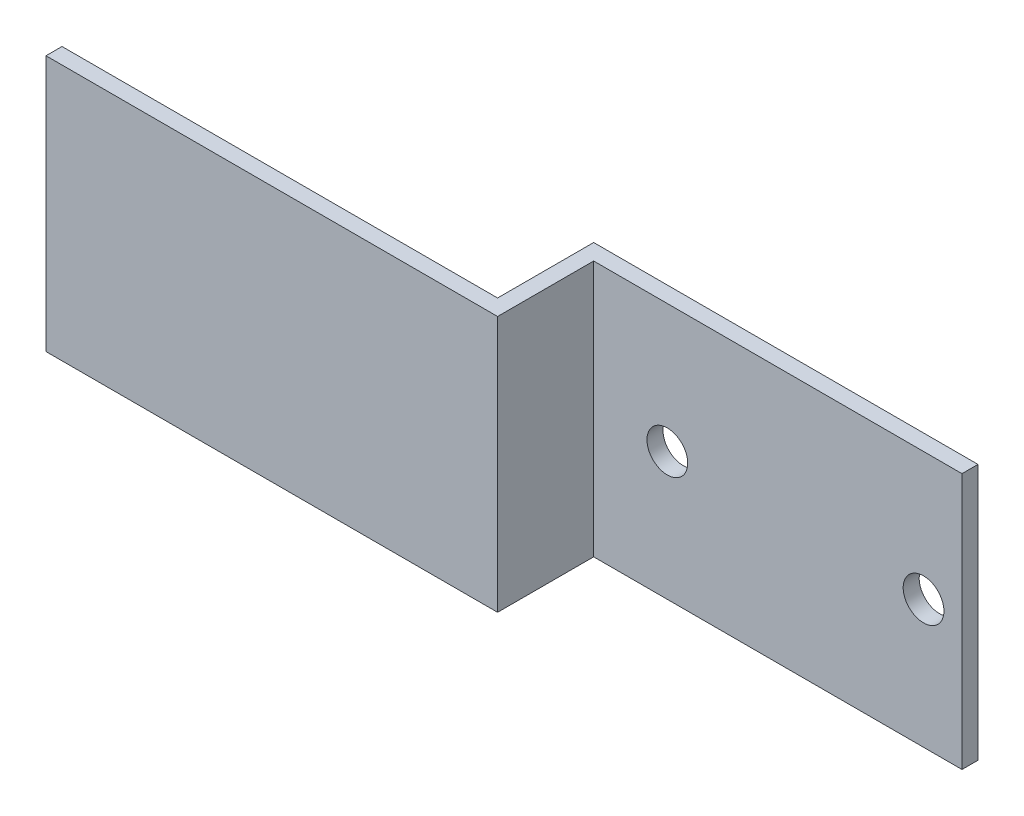
ISO-10303-21;
HEADER;
FILE_DESCRIPTION(('STEP AP214'),'2;1');
FILE_NAME('part.step','',(''),(''),'','','');
FILE_SCHEMA(('AUTOMOTIVE_DESIGN { 1 0 10303 214 1 1 1 1 }'));
ENDSEC;
DATA;
#1=APPLICATION_CONTEXT('core data for automotive mechanical design processes');
#2=APPLICATION_PROTOCOL_DEFINITION('international standard','automotive_design',2000,#1);
#3=PRODUCT_CONTEXT('',#1,'mechanical');
#4=PRODUCT('Part','Part','',(#3));
#5=PRODUCT_RELATED_PRODUCT_CATEGORY('part','',(#4));
#6=PRODUCT_DEFINITION_FORMATION('','',#4);
#7=PRODUCT_DEFINITION_CONTEXT('part definition',#1,'design');
#8=PRODUCT_DEFINITION('design','',#6,#7);
#9=PRODUCT_DEFINITION_SHAPE('','',#8);
#10=(LENGTH_UNIT() NAMED_UNIT(*) SI_UNIT(.MILLI.,.METRE.));
#11=(NAMED_UNIT(*) PLANE_ANGLE_UNIT() SI_UNIT($,.RADIAN.));
#12=(NAMED_UNIT(*) SI_UNIT($,.STERADIAN.) SOLID_ANGLE_UNIT());
#13=UNCERTAINTY_MEASURE_WITH_UNIT(LENGTH_MEASURE(1.E-05),#10,'distance_accuracy_value','');
#14=(GEOMETRIC_REPRESENTATION_CONTEXT(3) GLOBAL_UNCERTAINTY_ASSIGNED_CONTEXT((#13)) GLOBAL_UNIT_ASSIGNED_CONTEXT((#10,
#11,#12)) REPRESENTATION_CONTEXT('',''));
#15=CARTESIAN_POINT('',(0.,0.,0.));
#16=DIRECTION('',(0.,0.,1.));
#17=DIRECTION('',(1.,0.,0.));
#18=AXIS2_PLACEMENT_3D('',#15,#16,#17);
#19=CARTESIAN_POINT('',(0.,0.,1.5875));
#20=DIRECTION('',(0.,0.,1.));
#21=DIRECTION('',(1.,0.,0.));
#22=AXIS2_PLACEMENT_3D('',#19,#20,#21);
#23=PLANE('',#22);
#24=CARTESIAN_POINT('',(8.89,12.7,1.5875));
#25=DIRECTION('',(0.,0.,1.));
#26=DIRECTION('',(1.,0.,0.));
#27=AXIS2_PLACEMENT_3D('',#24,#25,#26);
#28=CIRCLE('',#27,2.0193);
#29=CARTESIAN_POINT('',(10.9093,12.7,1.5875));
#30=VERTEX_POINT('',#29);
#31=EDGE_CURVE('E204',#30,#30,#28,.T.);
#32=ORIENTED_EDGE('',*,*,#31,.F.);
#33=EDGE_LOOP('',(#32));
#34=FACE_BOUND('',#33,.T.);
#35=CARTESIAN_POINT('',(34.29,12.7,1.5875));
#36=DIRECTION('',(0.,0.,1.));
#37=DIRECTION('',(1.,0.,0.));
#38=AXIS2_PLACEMENT_3D('',#35,#36,#37);
#39=CIRCLE('',#38,2.0193);
#40=CARTESIAN_POINT('',(36.3093,12.7,1.5875));
#41=VERTEX_POINT('',#40);
#42=EDGE_CURVE('E195',#41,#41,#39,.T.);
#43=ORIENTED_EDGE('',*,*,#42,.F.);
#44=EDGE_LOOP('',(#43));
#45=FACE_BOUND('',#44,.T.);
#46=DIRECTION('',(-1.,0.,0.));
#47=VECTOR('',#46,1.);
#48=CARTESIAN_POINT('',(38.1,25.4,1.5875));
#49=LINE('',#48,#47);
#50=CARTESIAN_POINT('',(38.1,25.4,1.5875));
#51=VERTEX_POINT('',#50);
#52=CARTESIAN_POINT('',(1.58749999999999,25.4,1.5875));
#53=VERTEX_POINT('',#52);
#54=EDGE_CURVE('E170',#51,#53,#49,.T.);
#55=ORIENTED_EDGE('',*,*,#54,.T.);
#56=DIRECTION('',(0.,-1.,0.));
#57=VECTOR('',#56,1.);
#58=CARTESIAN_POINT('',(1.58749999999999,25.4,1.5875));
#59=LINE('',#58,#57);
#60=CARTESIAN_POINT('',(1.58749999999999,0.,1.5875));
#61=VERTEX_POINT('',#60);
#62=EDGE_CURVE('E142',#53,#61,#59,.T.);
#63=ORIENTED_EDGE('',*,*,#62,.T.);
#64=DIRECTION('',(1.,0.,0.));
#65=VECTOR('',#64,1.);
#66=CARTESIAN_POINT('',(0.,0.,1.5875));
#67=LINE('',#66,#65);
#68=CARTESIAN_POINT('',(38.1,0.,1.5875));
#69=VERTEX_POINT('',#68);
#70=EDGE_CURVE('E163',#61,#69,#67,.T.);
#71=ORIENTED_EDGE('',*,*,#70,.T.);
#72=DIRECTION('',(0.,1.,0.));
#73=VECTOR('',#72,1.);
#74=CARTESIAN_POINT('',(38.1,0.,1.5875));
#75=LINE('',#74,#73);
#76=EDGE_CURVE('E166',#69,#51,#75,.T.);
#77=ORIENTED_EDGE('',*,*,#76,.T.);
#78=EDGE_LOOP('',(#55,#63,#71,#77));
#79=FACE_BOUND('',#78,.T.);
#80=ADVANCED_FACE('F39',(#34,#45,#79),#23,.T.);
#81=CARTESIAN_POINT('',(0.,25.4,1.5875));
#82=DIRECTION('',(1.,0.,0.));
#83=DIRECTION('',(0.,1.,0.));
#84=AXIS2_PLACEMENT_3D('',#81,#82,#83);
#85=PLANE('',#84);
#86=DIRECTION('',(0.,0.,-1.));
#87=VECTOR('',#86,1.);
#88=CARTESIAN_POINT('',(0.,0.,1.5875));
#89=LINE('',#88,#87);
#90=CARTESIAN_POINT('',(0.,0.,9.525));
#91=VERTEX_POINT('',#90);
#92=CARTESIAN_POINT('',(0.,0.,0.));
#93=VERTEX_POINT('',#92);
#94=EDGE_CURVE('E11',#91,#93,#89,.T.);
#95=ORIENTED_EDGE('',*,*,#94,.F.);
#96=DIRECTION('',(0.,1.,0.));
#97=VECTOR('',#96,1.);
#98=CARTESIAN_POINT('',(0.,25.4,9.525));
#99=LINE('',#98,#97);
#100=CARTESIAN_POINT('',(0.,25.4,9.525));
#101=VERTEX_POINT('',#100);
#102=EDGE_CURVE('E130',#91,#101,#99,.T.);
#103=ORIENTED_EDGE('',*,*,#102,.T.);
#104=DIRECTION('',(0.,0.,-1.));
#105=VECTOR('',#104,1.);
#106=CARTESIAN_POINT('',(0.,25.4,1.5875));
#107=LINE('',#106,#105);
#108=CARTESIAN_POINT('',(0.,25.4,0.));
#109=VERTEX_POINT('',#108);
#110=EDGE_CURVE('E128',#101,#109,#107,.T.);
#111=ORIENTED_EDGE('',*,*,#110,.T.);
#112=DIRECTION('',(0.,-1.,0.));
#113=VECTOR('',#112,1.);
#114=CARTESIAN_POINT('',(0.,25.4,0.));
#115=LINE('',#114,#113);
#116=EDGE_CURVE('E160',#109,#93,#115,.T.);
#117=ORIENTED_EDGE('',*,*,#116,.T.);
#118=EDGE_LOOP('',(#95,#103,#111,#117));
#119=FACE_BOUND('',#118,.T.);
#120=ADVANCED_FACE('F41',(#119),#85,.F.);
#121=CARTESIAN_POINT('',(0.,0.,1.5875));
#122=DIRECTION('',(0.,1.,0.));
#123=DIRECTION('',(0.,0.,1.));
#124=AXIS2_PLACEMENT_3D('',#121,#122,#123);
#125=PLANE('',#124);
#126=DIRECTION('',(1.,0.,0.));
#127=VECTOR('',#126,1.);
#128=CARTESIAN_POINT('',(0.,0.,0.));
#129=LINE('',#128,#127);
#130=CARTESIAN_POINT('',(38.1,0.,0.));
#131=VERTEX_POINT('',#130);
#132=EDGE_CURVE('E177',#93,#131,#129,.T.);
#133=ORIENTED_EDGE('',*,*,#132,.T.);
#134=DIRECTION('',(0.,0.,-1.));
#135=VECTOR('',#134,1.);
#136=CARTESIAN_POINT('',(38.1,0.,1.5875));
#137=LINE('',#136,#135);
#138=EDGE_CURVE('E49',#69,#131,#137,.T.);
#139=ORIENTED_EDGE('',*,*,#138,.F.);
#140=ORIENTED_EDGE('',*,*,#70,.F.);
#141=DIRECTION('',(0.,0.,1.));
#142=VECTOR('',#141,1.);
#143=CARTESIAN_POINT('',(1.5875,0.,1.5875));
#144=LINE('',#143,#142);
#145=CARTESIAN_POINT('',(1.5875,0.,11.1125));
#146=VERTEX_POINT('',#145);
#147=EDGE_CURVE('E65',#61,#146,#144,.T.);
#148=ORIENTED_EDGE('',*,*,#147,.T.);
#149=DIRECTION('',(-1.,0.,0.));
#150=VECTOR('',#149,1.);
#151=CARTESIAN_POINT('',(1.5875,0.,11.1125));
#152=LINE('',#151,#150);
#153=CARTESIAN_POINT('',(-43.18,0.,11.1125));
#154=VERTEX_POINT('',#153);
#155=EDGE_CURVE('E156',#146,#154,#152,.T.);
#156=ORIENTED_EDGE('',*,*,#155,.T.);
#157=DIRECTION('',(0.,0.,1.));
#158=VECTOR('',#157,1.);
#159=CARTESIAN_POINT('',(-43.18,0.,9.525));
#160=LINE('',#159,#158);
#161=CARTESIAN_POINT('',(-43.18,0.,9.525));
#162=VERTEX_POINT('',#161);
#163=EDGE_CURVE('E118',#162,#154,#160,.T.);
#164=ORIENTED_EDGE('',*,*,#163,.F.);
#165=DIRECTION('',(1.,0.,0.));
#166=VECTOR('',#165,1.);
#167=CARTESIAN_POINT('',(0.,0.,9.525));
#168=LINE('',#167,#166);
#169=EDGE_CURVE('E119',#162,#91,#168,.T.);
#170=ORIENTED_EDGE('',*,*,#169,.T.);
#171=ORIENTED_EDGE('',*,*,#94,.T.);
#172=EDGE_LOOP('',(#133,#139,#140,#148,#156,#164,#170,#171));
#173=FACE_BOUND('',#172,.T.);
#174=ADVANCED_FACE('F226',(#173),#125,.F.);
#175=CARTESIAN_POINT('',(38.1,0.,1.5875));
#176=DIRECTION('',(-1.,0.,0.));
#177=DIRECTION('',(0.,-1.,0.));
#178=AXIS2_PLACEMENT_3D('',#175,#176,#177);
#179=PLANE('',#178);
#180=DIRECTION('',(0.,1.,0.));
#181=VECTOR('',#180,1.);
#182=CARTESIAN_POINT('',(38.1,0.,0.));
#183=LINE('',#182,#181);
#184=CARTESIAN_POINT('',(38.1,25.4,0.));
#185=VERTEX_POINT('',#184);
#186=EDGE_CURVE('E180',#131,#185,#183,.T.);
#187=ORIENTED_EDGE('',*,*,#186,.T.);
#188=DIRECTION('',(0.,0.,-1.));
#189=VECTOR('',#188,1.);
#190=CARTESIAN_POINT('',(38.1,25.4,1.5875));
#191=LINE('',#190,#189);
#192=EDGE_CURVE('E187',#51,#185,#191,.T.);
#193=ORIENTED_EDGE('',*,*,#192,.F.);
#194=ORIENTED_EDGE('',*,*,#76,.F.);
#195=ORIENTED_EDGE('',*,*,#138,.T.);
#196=EDGE_LOOP('',(#187,#193,#194,#195));
#197=FACE_BOUND('',#196,.T.);
#198=ADVANCED_FACE('F231',(#197),#179,.F.);
#199=CARTESIAN_POINT('',(38.1,25.4,1.5875));
#200=DIRECTION('',(0.,-1.,0.));
#201=DIRECTION('',(0.,0.,-1.));
#202=AXIS2_PLACEMENT_3D('',#199,#200,#201);
#203=PLANE('',#202);
#204=DIRECTION('',(-1.,0.,0.));
#205=VECTOR('',#204,1.);
#206=CARTESIAN_POINT('',(38.1,25.4,0.));
#207=LINE('',#206,#205);
#208=EDGE_CURVE('E167',#185,#109,#207,.T.);
#209=ORIENTED_EDGE('',*,*,#208,.T.);
#210=ORIENTED_EDGE('',*,*,#110,.F.);
#211=DIRECTION('',(-1.,0.,0.));
#212=VECTOR('',#211,1.);
#213=CARTESIAN_POINT('',(-43.18,25.4,9.525));
#214=LINE('',#213,#212);
#215=CARTESIAN_POINT('',(-43.18,25.4,9.525));
#216=VERTEX_POINT('',#215);
#217=EDGE_CURVE('E57',#101,#216,#214,.T.);
#218=ORIENTED_EDGE('',*,*,#217,.T.);
#219=DIRECTION('',(0.,0.,1.));
#220=VECTOR('',#219,1.);
#221=CARTESIAN_POINT('',(-43.18,25.4,9.525));
#222=LINE('',#221,#220);
#223=CARTESIAN_POINT('',(-43.18,25.4,11.1125));
#224=VERTEX_POINT('',#223);
#225=EDGE_CURVE('E109',#216,#224,#222,.T.);
#226=ORIENTED_EDGE('',*,*,#225,.T.);
#227=DIRECTION('',(-1.,0.,0.));
#228=VECTOR('',#227,1.);
#229=CARTESIAN_POINT('',(1.58749999999999,25.4,11.1125));
#230=LINE('',#229,#228);
#231=CARTESIAN_POINT('',(1.58749999999999,25.4,11.1125));
#232=VERTEX_POINT('',#231);
#233=EDGE_CURVE('E157',#232,#224,#230,.T.);
#234=ORIENTED_EDGE('',*,*,#233,.F.);
#235=DIRECTION('',(0.,0.,-1.));
#236=VECTOR('',#235,1.);
#237=CARTESIAN_POINT('',(1.58749999999999,25.4,11.1125));
#238=LINE('',#237,#236);
#239=EDGE_CURVE('E152',#232,#53,#238,.T.);
#240=ORIENTED_EDGE('',*,*,#239,.T.);
#241=ORIENTED_EDGE('',*,*,#54,.F.);
#242=ORIENTED_EDGE('',*,*,#192,.T.);
#243=EDGE_LOOP('',(#209,#210,#218,#226,#234,#240,#241,#242));
#244=FACE_BOUND('',#243,.T.);
#245=ADVANCED_FACE('F127',(#244),#203,.F.);
#246=CARTESIAN_POINT('',(0.,0.,0.));
#247=DIRECTION('',(0.,0.,1.));
#248=DIRECTION('',(1.,0.,0.));
#249=AXIS2_PLACEMENT_3D('',#246,#247,#248);
#250=PLANE('',#249);
#251=CARTESIAN_POINT('',(8.89,12.7,0.));
#252=DIRECTION('',(0.,0.,1.));
#253=DIRECTION('',(1.,0.,0.));
#254=AXIS2_PLACEMENT_3D('',#251,#252,#253);
#255=CIRCLE('',#254,2.0193);
#256=CARTESIAN_POINT('',(10.9093,12.7,0.));
#257=VERTEX_POINT('',#256);
#258=EDGE_CURVE('E43',#257,#257,#255,.T.);
#259=ORIENTED_EDGE('',*,*,#258,.T.);
#260=EDGE_LOOP('',(#259));
#261=FACE_BOUND('',#260,.T.);
#262=CARTESIAN_POINT('',(34.29,12.7,0.));
#263=DIRECTION('',(0.,0.,1.));
#264=DIRECTION('',(1.,0.,0.));
#265=AXIS2_PLACEMENT_3D('',#262,#263,#264);
#266=CIRCLE('',#265,2.0193);
#267=CARTESIAN_POINT('',(36.3093,12.7,0.));
#268=VERTEX_POINT('',#267);
#269=EDGE_CURVE('E140',#268,#268,#266,.T.);
#270=ORIENTED_EDGE('',*,*,#269,.T.);
#271=EDGE_LOOP('',(#270));
#272=FACE_BOUND('',#271,.T.);
#273=ORIENTED_EDGE('',*,*,#116,.F.);
#274=ORIENTED_EDGE('',*,*,#208,.F.);
#275=ORIENTED_EDGE('',*,*,#186,.F.);
#276=ORIENTED_EDGE('',*,*,#132,.F.);
#277=EDGE_LOOP('',(#273,#274,#275,#276));
#278=FACE_BOUND('',#277,.T.);
#279=ADVANCED_FACE('F234',(#261,#272,#278),#250,.F.);
#280=CARTESIAN_POINT('',(1.5875,0.,11.1125));
#281=DIRECTION('',(0.,0.,1.));
#282=DIRECTION('',(1.,0.,0.));
#283=AXIS2_PLACEMENT_3D('',#280,#281,#282);
#284=PLANE('',#283);
#285=ORIENTED_EDGE('',*,*,#233,.T.);
#286=DIRECTION('',(0.,-1.,0.));
#287=VECTOR('',#286,1.);
#288=CARTESIAN_POINT('',(-43.18,0.,11.1125));
#289=LINE('',#288,#287);
#290=EDGE_CURVE('E115',#224,#154,#289,.T.);
#291=ORIENTED_EDGE('',*,*,#290,.T.);
#292=ORIENTED_EDGE('',*,*,#155,.F.);
#293=DIRECTION('',(0.,1.,0.));
#294=VECTOR('',#293,1.);
#295=CARTESIAN_POINT('',(1.5875,0.,11.1125));
#296=LINE('',#295,#294);
#297=EDGE_CURVE('E148',#146,#232,#296,.T.);
#298=ORIENTED_EDGE('',*,*,#297,.T.);
#299=EDGE_LOOP('',(#285,#291,#292,#298));
#300=FACE_BOUND('',#299,.T.);
#301=ADVANCED_FACE('F237',(#300),#284,.T.);
#302=CARTESIAN_POINT('',(1.5875,0.,0.));
#303=DIRECTION('',(-1.,0.,0.));
#304=DIRECTION('',(0.,-1.,0.));
#305=AXIS2_PLACEMENT_3D('',#302,#303,#304);
#306=PLANE('',#305);
#307=ORIENTED_EDGE('',*,*,#62,.F.);
#308=ORIENTED_EDGE('',*,*,#239,.F.);
#309=ORIENTED_EDGE('',*,*,#297,.F.);
#310=ORIENTED_EDGE('',*,*,#147,.F.);
#311=EDGE_LOOP('',(#307,#308,#309,#310));
#312=FACE_BOUND('',#311,.T.);
#313=ADVANCED_FACE('F223',(#312),#306,.F.);
#314=CARTESIAN_POINT('',(-43.18,0.,9.525));
#315=DIRECTION('',(-1.,0.,0.));
#316=DIRECTION('',(0.,0.,1.));
#317=AXIS2_PLACEMENT_3D('',#314,#315,#316);
#318=PLANE('',#317);
#319=ORIENTED_EDGE('',*,*,#290,.F.);
#320=ORIENTED_EDGE('',*,*,#225,.F.);
#321=DIRECTION('',(0.,-1.,0.));
#322=VECTOR('',#321,1.);
#323=CARTESIAN_POINT('',(-43.18,0.,9.525));
#324=LINE('',#323,#322);
#325=EDGE_CURVE('E112',#216,#162,#324,.T.);
#326=ORIENTED_EDGE('',*,*,#325,.T.);
#327=ORIENTED_EDGE('',*,*,#163,.T.);
#328=EDGE_LOOP('',(#319,#320,#326,#327));
#329=FACE_BOUND('',#328,.T.);
#330=ADVANCED_FACE('F110',(#329),#318,.T.);
#331=CARTESIAN_POINT('',(0.,0.,9.525));
#332=DIRECTION('',(0.,0.,-1.));
#333=DIRECTION('',(-1.,0.,0.));
#334=AXIS2_PLACEMENT_3D('',#331,#332,#333);
#335=PLANE('',#334);
#336=ORIENTED_EDGE('',*,*,#102,.F.);
#337=ORIENTED_EDGE('',*,*,#169,.F.);
#338=ORIENTED_EDGE('',*,*,#325,.F.);
#339=ORIENTED_EDGE('',*,*,#217,.F.);
#340=EDGE_LOOP('',(#336,#337,#338,#339));
#341=FACE_BOUND('',#340,.T.);
#342=ADVANCED_FACE('F121',(#341),#335,.T.);
#343=CARTESIAN_POINT('',(34.29,12.7,-0.9525));
#344=DIRECTION('',(0.,0.,1.));
#345=DIRECTION('',(1.,0.,0.));
#346=AXIS2_PLACEMENT_3D('',#343,#344,#345);
#347=CYLINDRICAL_SURFACE('',#346,2.0193);
#348=ORIENTED_EDGE('',*,*,#42,.T.);
#349=EDGE_LOOP('',(#348));
#350=FACE_BOUND('',#349,.T.);
#351=ORIENTED_EDGE('',*,*,#269,.F.);
#352=EDGE_LOOP('',(#351));
#353=FACE_BOUND('',#352,.T.);
#354=ADVANCED_FACE('F270',(#350,#353),#347,.F.);
#355=CARTESIAN_POINT('',(8.89,12.7,-0.9525));
#356=DIRECTION('',(0.,0.,1.));
#357=DIRECTION('',(1.,0.,0.));
#358=AXIS2_PLACEMENT_3D('',#355,#356,#357);
#359=CYLINDRICAL_SURFACE('',#358,2.0193);
#360=ORIENTED_EDGE('',*,*,#31,.T.);
#361=EDGE_LOOP('',(#360));
#362=FACE_BOUND('',#361,.T.);
#363=ORIENTED_EDGE('',*,*,#258,.F.);
#364=EDGE_LOOP('',(#363));
#365=FACE_BOUND('',#364,.T.);
#366=ADVANCED_FACE('F210',(#362,#365),#359,.F.);
#367=CLOSED_SHELL('',(#80,#120,#174,#198,#245,#279,#301,#313,#330,#342,#354,#366));
#368=MANIFOLD_SOLID_BREP('B2',#367);
#369=ADVANCED_BREP_SHAPE_REPRESENTATION('',(#18,#368),#14);
#370=SHAPE_DEFINITION_REPRESENTATION(#9,#369);
ENDSEC;
END-ISO-10303-21;
